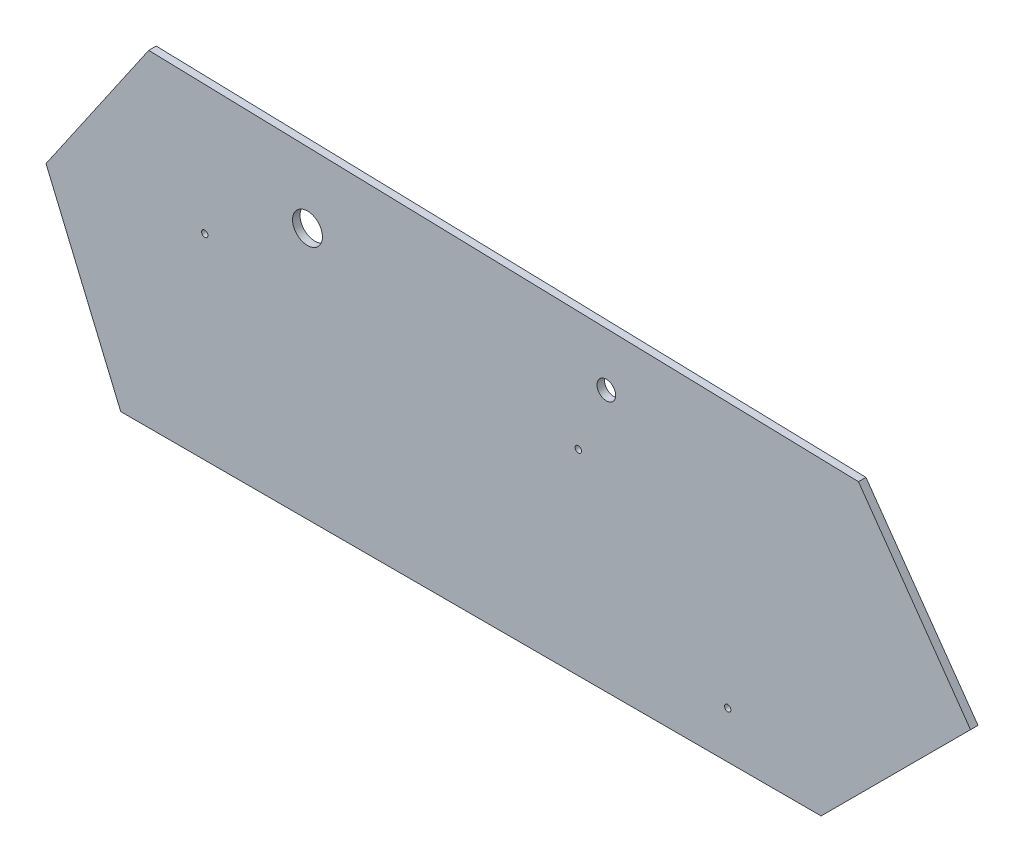
ISO-10303-21;
HEADER;
FILE_DESCRIPTION(('STEP AP214'),'2;1');
FILE_NAME('part.step','',(''),(''),'','','');
FILE_SCHEMA(('AUTOMOTIVE_DESIGN { 1 0 10303 214 1 1 1 1 }'));
ENDSEC;
DATA;
#1=APPLICATION_CONTEXT('core data for automotive mechanical design processes');
#2=APPLICATION_PROTOCOL_DEFINITION('international standard','automotive_design',2000,#1);
#3=PRODUCT_CONTEXT('',#1,'mechanical');
#4=PRODUCT('Part','Part','',(#3));
#5=PRODUCT_RELATED_PRODUCT_CATEGORY('part','',(#4));
#6=PRODUCT_DEFINITION_FORMATION('','',#4);
#7=PRODUCT_DEFINITION_CONTEXT('part definition',#1,'design');
#8=PRODUCT_DEFINITION('design','',#6,#7);
#9=PRODUCT_DEFINITION_SHAPE('','',#8);
#10=(LENGTH_UNIT() NAMED_UNIT(*) SI_UNIT(.MILLI.,.METRE.));
#11=(NAMED_UNIT(*) PLANE_ANGLE_UNIT() SI_UNIT($,.RADIAN.));
#12=(NAMED_UNIT(*) SI_UNIT($,.STERADIAN.) SOLID_ANGLE_UNIT());
#13=UNCERTAINTY_MEASURE_WITH_UNIT(LENGTH_MEASURE(1.E-05),#10,'distance_accuracy_value','');
#14=(GEOMETRIC_REPRESENTATION_CONTEXT(3) GLOBAL_UNCERTAINTY_ASSIGNED_CONTEXT((#13)) GLOBAL_UNIT_ASSIGNED_CONTEXT((#10,
#11,#12)) REPRESENTATION_CONTEXT('',''));
#15=CARTESIAN_POINT('',(0.,0.,0.));
#16=DIRECTION('',(0.,0.,1.));
#17=DIRECTION('',(1.,0.,0.));
#18=AXIS2_PLACEMENT_3D('',#15,#16,#17);
#19=CARTESIAN_POINT('',(0.,0.,4.));
#20=DIRECTION('',(0.,0.,1.));
#21=DIRECTION('',(1.,0.,0.));
#22=AXIS2_PLACEMENT_3D('',#19,#20,#21);
#23=PLANE('',#22);
#24=CARTESIAN_POINT('',(-25.,90.,4.));
#25=DIRECTION('',(0.,0.,1.));
#26=DIRECTION('',(1.,0.,0.));
#27=AXIS2_PLACEMENT_3D('',#24,#25,#26);
#28=CIRCLE('',#27,8.);
#29=CARTESIAN_POINT('',(-17.,90.,4.));
#30=VERTEX_POINT('',#29);
#31=EDGE_CURVE('E203',#30,#30,#28,.T.);
#32=ORIENTED_EDGE('',*,*,#31,.F.);
#33=EDGE_LOOP('',(#32));
#34=FACE_BOUND('',#33,.T.);
#35=CARTESIAN_POINT('',(120.,60.,4.));
#36=DIRECTION('',(0.,0.,1.));
#37=DIRECTION('',(1.,0.,0.));
#38=AXIS2_PLACEMENT_3D('',#35,#36,#37);
#39=CIRCLE('',#38,1.7);
#40=CARTESIAN_POINT('',(121.7,60.,4.));
#41=VERTEX_POINT('',#40);
#42=EDGE_CURVE('E213',#41,#41,#39,.T.);
#43=ORIENTED_EDGE('',*,*,#42,.F.);
#44=EDGE_LOOP('',(#43));
#45=FACE_BOUND('',#44,.T.);
#46=DIRECTION('',(0.388057000058133,-0.921635375138065,0.));
#47=VECTOR('',#46,1.);
#48=CARTESIAN_POINT('',(-165.,50.,4.));
#49=LINE('',#48,#47);
#50=CARTESIAN_POINT('',(-165.,50.,4.));
#51=VERTEX_POINT('',#50);
#52=CARTESIAN_POINT('',(-125.,-45.,4.));
#53=VERTEX_POINT('',#52);
#54=EDGE_CURVE('E140',#51,#53,#49,.T.);
#55=ORIENTED_EDGE('',*,*,#54,.T.);
#56=DIRECTION('',(1.,0.,0.));
#57=VECTOR('',#56,1.);
#58=CARTESIAN_POINT('',(-125.,-45.,4.));
#59=LINE('',#58,#57);
#60=CARTESIAN_POINT('',(250.,-45.,4.));
#61=VERTEX_POINT('',#60);
#62=EDGE_CURVE('E92',#53,#61,#59,.T.);
#63=ORIENTED_EDGE('',*,*,#62,.T.);
#64=DIRECTION('',(0.707106781186546,0.707106781186549,0.));
#65=VECTOR('',#64,1.);
#66=CARTESIAN_POINT('',(250.,-45.,4.));
#67=LINE('',#66,#65);
#68=CARTESIAN_POINT('',(330.,35.0000000000002,4.));
#69=VERTEX_POINT('',#68);
#70=EDGE_CURVE('E107',#61,#69,#67,.T.);
#71=ORIENTED_EDGE('',*,*,#70,.T.);
#72=DIRECTION('',(-0.576683197598655,0.816967863264762,0.));
#73=VECTOR('',#72,1.);
#74=CARTESIAN_POINT('',(330.,35.0000000000002,4.));
#75=LINE('',#74,#73);
#76=CARTESIAN_POINT('',(270.,120.,4.));
#77=VERTEX_POINT('',#76);
#78=EDGE_CURVE('E105',#69,#77,#75,.T.);
#79=ORIENTED_EDGE('',*,*,#78,.T.);
#80=DIRECTION('',(-0.999653919352847,0.0263066820882328,0.));
#81=VECTOR('',#80,1.);
#82=CARTESIAN_POINT('',(270.,120.,4.));
#83=LINE('',#82,#81);
#84=CARTESIAN_POINT('',(-110.,130.,4.));
#85=VERTEX_POINT('',#84);
#86=EDGE_CURVE('E106',#77,#85,#83,.T.);
#87=ORIENTED_EDGE('',*,*,#86,.T.);
#88=DIRECTION('',(-0.566528822887065,-0.824041924199368,0.));
#89=VECTOR('',#88,1.);
#90=CARTESIAN_POINT('',(-110.,130.,4.));
#91=LINE('',#90,#89);
#92=EDGE_CURVE('E59',#85,#51,#91,.T.);
#93=ORIENTED_EDGE('',*,*,#92,.T.);
#94=EDGE_LOOP('',(#55,#63,#71,#79,#87,#93));
#95=FACE_BOUND('',#94,.T.);
#96=CARTESIAN_POINT('',(-80.,60.,4.));
#97=DIRECTION('',(0.,0.,1.));
#98=DIRECTION('',(1.,0.,0.));
#99=AXIS2_PLACEMENT_3D('',#96,#97,#98);
#100=CIRCLE('',#99,1.7);
#101=CARTESIAN_POINT('',(-78.3,60.,4.));
#102=VERTEX_POINT('',#101);
#103=EDGE_CURVE('E128',#102,#102,#100,.T.);
#104=ORIENTED_EDGE('',*,*,#103,.F.);
#105=EDGE_LOOP('',(#104));
#106=FACE_BOUND('',#105,.T.);
#107=CARTESIAN_POINT('',(200.,-20.,4.));
#108=DIRECTION('',(0.,0.,1.));
#109=DIRECTION('',(1.,0.,0.));
#110=AXIS2_PLACEMENT_3D('',#107,#108,#109);
#111=CIRCLE('',#110,1.70000000000001);
#112=CARTESIAN_POINT('',(201.7,-20.,4.));
#113=VERTEX_POINT('',#112);
#114=EDGE_CURVE('E210',#113,#113,#111,.T.);
#115=ORIENTED_EDGE('',*,*,#114,.F.);
#116=EDGE_LOOP('',(#115));
#117=FACE_BOUND('',#116,.T.);
#118=CARTESIAN_POINT('',(135.,95.,4.));
#119=DIRECTION('',(0.,0.,1.));
#120=DIRECTION('',(1.,0.,0.));
#121=AXIS2_PLACEMENT_3D('',#118,#119,#120);
#122=CIRCLE('',#121,4.99999999999999);
#123=CARTESIAN_POINT('',(140.,95.,4.));
#124=VERTEX_POINT('',#123);
#125=EDGE_CURVE('E195',#124,#124,#122,.T.);
#126=ORIENTED_EDGE('',*,*,#125,.F.);
#127=EDGE_LOOP('',(#126));
#128=FACE_BOUND('',#127,.T.);
#129=ADVANCED_FACE('F41',(#34,#45,#95,#106,#117,#128),#23,.T.);
#130=CARTESIAN_POINT('',(0.,0.,0.));
#131=DIRECTION('',(0.,0.,1.));
#132=DIRECTION('',(1.,0.,0.));
#133=AXIS2_PLACEMENT_3D('',#130,#131,#132);
#134=PLANE('',#133);
#135=DIRECTION('',(0.388057000058133,-0.921635375138065,0.));
#136=VECTOR('',#135,1.);
#137=CARTESIAN_POINT('',(-165.,50.,0.));
#138=LINE('',#137,#136);
#139=CARTESIAN_POINT('',(-165.,50.,0.));
#140=VERTEX_POINT('',#139);
#141=CARTESIAN_POINT('',(-125.,-45.,0.));
#142=VERTEX_POINT('',#141);
#143=EDGE_CURVE('E127',#140,#142,#138,.T.);
#144=ORIENTED_EDGE('',*,*,#143,.F.);
#145=DIRECTION('',(-0.566528822887065,-0.824041924199368,0.));
#146=VECTOR('',#145,1.);
#147=CARTESIAN_POINT('',(-110.,130.,0.));
#148=LINE('',#147,#146);
#149=CARTESIAN_POINT('',(-110.,130.,0.));
#150=VERTEX_POINT('',#149);
#151=EDGE_CURVE('E87',#150,#140,#148,.T.);
#152=ORIENTED_EDGE('',*,*,#151,.F.);
#153=DIRECTION('',(-0.999653919352847,0.0263066820882328,0.));
#154=VECTOR('',#153,1.);
#155=CARTESIAN_POINT('',(270.,120.,0.));
#156=LINE('',#155,#154);
#157=CARTESIAN_POINT('',(270.,120.,0.));
#158=VERTEX_POINT('',#157);
#159=EDGE_CURVE('E82',#158,#150,#156,.T.);
#160=ORIENTED_EDGE('',*,*,#159,.F.);
#161=DIRECTION('',(-0.576683197598655,0.816967863264762,0.));
#162=VECTOR('',#161,1.);
#163=CARTESIAN_POINT('',(330.,35.0000000000002,0.));
#164=LINE('',#163,#162);
#165=CARTESIAN_POINT('',(330.,35.0000000000002,0.));
#166=VERTEX_POINT('',#165);
#167=EDGE_CURVE('E116',#166,#158,#164,.T.);
#168=ORIENTED_EDGE('',*,*,#167,.F.);
#169=DIRECTION('',(0.707106781186546,0.707106781186549,0.));
#170=VECTOR('',#169,1.);
#171=CARTESIAN_POINT('',(250.,-45.,0.));
#172=LINE('',#171,#170);
#173=CARTESIAN_POINT('',(250.,-45.,0.));
#174=VERTEX_POINT('',#173);
#175=EDGE_CURVE('E135',#174,#166,#172,.T.);
#176=ORIENTED_EDGE('',*,*,#175,.F.);
#177=DIRECTION('',(1.,0.,0.));
#178=VECTOR('',#177,1.);
#179=CARTESIAN_POINT('',(-125.,-45.,0.));
#180=LINE('',#179,#178);
#181=EDGE_CURVE('E129',#142,#174,#180,.T.);
#182=ORIENTED_EDGE('',*,*,#181,.F.);
#183=EDGE_LOOP('',(#144,#152,#160,#168,#176,#182));
#184=FACE_BOUND('',#183,.T.);
#185=CARTESIAN_POINT('',(-80.,60.,0.));
#186=DIRECTION('',(0.,0.,1.));
#187=DIRECTION('',(1.,0.,0.));
#188=AXIS2_PLACEMENT_3D('',#185,#186,#187);
#189=CIRCLE('',#188,1.7);
#190=CARTESIAN_POINT('',(-78.3,60.,0.));
#191=VERTEX_POINT('',#190);
#192=EDGE_CURVE('E216',#191,#191,#189,.T.);
#193=ORIENTED_EDGE('',*,*,#192,.T.);
#194=EDGE_LOOP('',(#193));
#195=FACE_BOUND('',#194,.T.);
#196=CARTESIAN_POINT('',(120.,60.,0.));
#197=DIRECTION('',(0.,0.,1.));
#198=DIRECTION('',(1.,0.,0.));
#199=AXIS2_PLACEMENT_3D('',#196,#197,#198);
#200=CIRCLE('',#199,1.7);
#201=CARTESIAN_POINT('',(121.7,60.,0.));
#202=VERTEX_POINT('',#201);
#203=EDGE_CURVE('E209',#202,#202,#200,.T.);
#204=ORIENTED_EDGE('',*,*,#203,.T.);
#205=EDGE_LOOP('',(#204));
#206=FACE_BOUND('',#205,.T.);
#207=CARTESIAN_POINT('',(200.,-20.,0.));
#208=DIRECTION('',(0.,0.,1.));
#209=DIRECTION('',(1.,0.,0.));
#210=AXIS2_PLACEMENT_3D('',#207,#208,#209);
#211=CIRCLE('',#210,1.70000000000001);
#212=CARTESIAN_POINT('',(201.7,-20.,0.));
#213=VERTEX_POINT('',#212);
#214=EDGE_CURVE('E204',#213,#213,#211,.T.);
#215=ORIENTED_EDGE('',*,*,#214,.T.);
#216=EDGE_LOOP('',(#215));
#217=FACE_BOUND('',#216,.T.);
#218=CARTESIAN_POINT('',(-25.,90.,0.));
#219=DIRECTION('',(0.,0.,1.));
#220=DIRECTION('',(1.,0.,0.));
#221=AXIS2_PLACEMENT_3D('',#218,#219,#220);
#222=CIRCLE('',#221,8.);
#223=CARTESIAN_POINT('',(-17.,90.,0.));
#224=VERTEX_POINT('',#223);
#225=EDGE_CURVE('E196',#224,#224,#222,.T.);
#226=ORIENTED_EDGE('',*,*,#225,.T.);
#227=EDGE_LOOP('',(#226));
#228=FACE_BOUND('',#227,.T.);
#229=CARTESIAN_POINT('',(135.,95.,0.));
#230=DIRECTION('',(0.,0.,1.));
#231=DIRECTION('',(1.,0.,0.));
#232=AXIS2_PLACEMENT_3D('',#229,#230,#231);
#233=CIRCLE('',#232,4.99999999999999);
#234=CARTESIAN_POINT('',(140.,95.,0.));
#235=VERTEX_POINT('',#234);
#236=EDGE_CURVE('E191',#235,#235,#233,.T.);
#237=ORIENTED_EDGE('',*,*,#236,.T.);
#238=EDGE_LOOP('',(#237));
#239=FACE_BOUND('',#238,.T.);
#240=ADVANCED_FACE('F148',(#184,#195,#206,#217,#228,#239),#134,.F.);
#241=CARTESIAN_POINT('',(-165.,50.,4.));
#242=DIRECTION('',(0.921635375138065,0.388057000058133,0.));
#243=DIRECTION('',(-0.388057000058133,0.921635375138065,0.));
#244=AXIS2_PLACEMENT_3D('',#241,#242,#243);
#245=PLANE('',#244);
#246=ORIENTED_EDGE('',*,*,#143,.T.);
#247=DIRECTION('',(0.,0.,-1.));
#248=VECTOR('',#247,1.);
#249=CARTESIAN_POINT('',(-125.,-45.,4.));
#250=LINE('',#249,#248);
#251=EDGE_CURVE('E11',#53,#142,#250,.T.);
#252=ORIENTED_EDGE('',*,*,#251,.F.);
#253=ORIENTED_EDGE('',*,*,#54,.F.);
#254=DIRECTION('',(0.,0.,-1.));
#255=VECTOR('',#254,1.);
#256=CARTESIAN_POINT('',(-165.,50.,4.));
#257=LINE('',#256,#255);
#258=EDGE_CURVE('E125',#51,#140,#257,.T.);
#259=ORIENTED_EDGE('',*,*,#258,.T.);
#260=EDGE_LOOP('',(#246,#252,#253,#259));
#261=FACE_BOUND('',#260,.T.);
#262=ADVANCED_FACE('F43',(#261),#245,.F.);
#263=CARTESIAN_POINT('',(-125.,-45.,4.));
#264=DIRECTION('',(0.,1.,0.));
#265=DIRECTION('',(0.,0.,1.));
#266=AXIS2_PLACEMENT_3D('',#263,#264,#265);
#267=PLANE('',#266);
#268=ORIENTED_EDGE('',*,*,#181,.T.);
#269=DIRECTION('',(0.,0.,-1.));
#270=VECTOR('',#269,1.);
#271=CARTESIAN_POINT('',(250.,-45.,4.));
#272=LINE('',#271,#270);
#273=EDGE_CURVE('E49',#61,#174,#272,.T.);
#274=ORIENTED_EDGE('',*,*,#273,.F.);
#275=ORIENTED_EDGE('',*,*,#62,.F.);
#276=ORIENTED_EDGE('',*,*,#251,.T.);
#277=EDGE_LOOP('',(#268,#274,#275,#276));
#278=FACE_BOUND('',#277,.T.);
#279=ADVANCED_FACE('F288',(#278),#267,.F.);
#280=CARTESIAN_POINT('',(250.,-45.,4.));
#281=DIRECTION('',(-0.707106781186549,0.707106781186546,0.));
#282=DIRECTION('',(-0.707106781186546,-0.707106781186549,0.));
#283=AXIS2_PLACEMENT_3D('',#280,#281,#282);
#284=PLANE('',#283);
#285=ORIENTED_EDGE('',*,*,#175,.T.);
#286=DIRECTION('',(0.,0.,-1.));
#287=VECTOR('',#286,1.);
#288=CARTESIAN_POINT('',(330.,35.0000000000002,4.));
#289=LINE('',#288,#287);
#290=EDGE_CURVE('E120',#69,#166,#289,.T.);
#291=ORIENTED_EDGE('',*,*,#290,.F.);
#292=ORIENTED_EDGE('',*,*,#70,.F.);
#293=ORIENTED_EDGE('',*,*,#273,.T.);
#294=EDGE_LOOP('',(#285,#291,#292,#293));
#295=FACE_BOUND('',#294,.T.);
#296=ADVANCED_FACE('F141',(#295),#284,.F.);
#297=CARTESIAN_POINT('',(330.,35.0000000000002,4.));
#298=DIRECTION('',(-0.816967863264762,-0.576683197598655,0.));
#299=DIRECTION('',(0.576683197598655,-0.816967863264762,0.));
#300=AXIS2_PLACEMENT_3D('',#297,#298,#299);
#301=PLANE('',#300);
#302=ORIENTED_EDGE('',*,*,#167,.T.);
#303=DIRECTION('',(0.,0.,-1.));
#304=VECTOR('',#303,1.);
#305=CARTESIAN_POINT('',(270.,120.,4.));
#306=LINE('',#305,#304);
#307=EDGE_CURVE('E114',#77,#158,#306,.T.);
#308=ORIENTED_EDGE('',*,*,#307,.F.);
#309=ORIENTED_EDGE('',*,*,#78,.F.);
#310=ORIENTED_EDGE('',*,*,#290,.T.);
#311=EDGE_LOOP('',(#302,#308,#309,#310));
#312=FACE_BOUND('',#311,.T.);
#313=ADVANCED_FACE('F111',(#312),#301,.F.);
#314=CARTESIAN_POINT('',(270.,120.,4.));
#315=DIRECTION('',(-0.0263066820882328,-0.999653919352847,0.));
#316=DIRECTION('',(0.999653919352847,-0.0263066820882328,0.));
#317=AXIS2_PLACEMENT_3D('',#314,#315,#316);
#318=PLANE('',#317);
#319=ORIENTED_EDGE('',*,*,#159,.T.);
#320=DIRECTION('',(0.,0.,-1.));
#321=VECTOR('',#320,1.);
#322=CARTESIAN_POINT('',(-110.,130.,4.));
#323=LINE('',#322,#321);
#324=EDGE_CURVE('E117',#85,#150,#323,.T.);
#325=ORIENTED_EDGE('',*,*,#324,.F.);
#326=ORIENTED_EDGE('',*,*,#86,.F.);
#327=ORIENTED_EDGE('',*,*,#307,.T.);
#328=EDGE_LOOP('',(#319,#325,#326,#327));
#329=FACE_BOUND('',#328,.T.);
#330=ADVANCED_FACE('F119',(#329),#318,.F.);
#331=CARTESIAN_POINT('',(-110.,130.,4.));
#332=DIRECTION('',(0.824041924199368,-0.566528822887065,0.));
#333=DIRECTION('',(0.566528822887065,0.824041924199368,0.));
#334=AXIS2_PLACEMENT_3D('',#331,#332,#333);
#335=PLANE('',#334);
#336=ORIENTED_EDGE('',*,*,#151,.T.);
#337=ORIENTED_EDGE('',*,*,#258,.F.);
#338=ORIENTED_EDGE('',*,*,#92,.F.);
#339=ORIENTED_EDGE('',*,*,#324,.T.);
#340=EDGE_LOOP('',(#336,#337,#338,#339));
#341=FACE_BOUND('',#340,.T.);
#342=ADVANCED_FACE('F151',(#341),#335,.F.);
#343=CARTESIAN_POINT('',(-80.,60.,4.));
#344=DIRECTION('',(0.,0.,-1.));
#345=DIRECTION('',(-1.,0.,0.));
#346=AXIS2_PLACEMENT_3D('',#343,#344,#345);
#347=CYLINDRICAL_SURFACE('',#346,1.7);
#348=ORIENTED_EDGE('',*,*,#103,.T.);
#349=EDGE_LOOP('',(#348));
#350=FACE_BOUND('',#349,.T.);
#351=ORIENTED_EDGE('',*,*,#192,.F.);
#352=EDGE_LOOP('',(#351));
#353=FACE_BOUND('',#352,.T.);
#354=ADVANCED_FACE('F153',(#350,#353),#347,.F.);
#355=CARTESIAN_POINT('',(120.,60.,4.));
#356=DIRECTION('',(0.,0.,-1.));
#357=DIRECTION('',(-1.,0.,0.));
#358=AXIS2_PLACEMENT_3D('',#355,#356,#357);
#359=CYLINDRICAL_SURFACE('',#358,1.7);
#360=ORIENTED_EDGE('',*,*,#42,.T.);
#361=EDGE_LOOP('',(#360));
#362=FACE_BOUND('',#361,.T.);
#363=ORIENTED_EDGE('',*,*,#203,.F.);
#364=EDGE_LOOP('',(#363));
#365=FACE_BOUND('',#364,.T.);
#366=ADVANCED_FACE('F157',(#362,#365),#359,.F.);
#367=CARTESIAN_POINT('',(200.,-20.,4.));
#368=DIRECTION('',(0.,0.,-1.));
#369=DIRECTION('',(-1.,0.,0.));
#370=AXIS2_PLACEMENT_3D('',#367,#368,#369);
#371=CYLINDRICAL_SURFACE('',#370,1.70000000000001);
#372=ORIENTED_EDGE('',*,*,#114,.T.);
#373=EDGE_LOOP('',(#372));
#374=FACE_BOUND('',#373,.T.);
#375=ORIENTED_EDGE('',*,*,#214,.F.);
#376=EDGE_LOOP('',(#375));
#377=FACE_BOUND('',#376,.T.);
#378=ADVANCED_FACE('F174',(#374,#377),#371,.F.);
#379=CARTESIAN_POINT('',(-25.,90.,4.));
#380=DIRECTION('',(0.,0.,-1.));
#381=DIRECTION('',(-1.,0.,0.));
#382=AXIS2_PLACEMENT_3D('',#379,#380,#381);
#383=CYLINDRICAL_SURFACE('',#382,8.);
#384=ORIENTED_EDGE('',*,*,#31,.T.);
#385=EDGE_LOOP('',(#384));
#386=FACE_BOUND('',#385,.T.);
#387=ORIENTED_EDGE('',*,*,#225,.F.);
#388=EDGE_LOOP('',(#387));
#389=FACE_BOUND('',#388,.T.);
#390=ADVANCED_FACE('F179',(#386,#389),#383,.F.);
#391=CARTESIAN_POINT('',(135.,95.,4.));
#392=DIRECTION('',(0.,0.,-1.));
#393=DIRECTION('',(-1.,0.,0.));
#394=AXIS2_PLACEMENT_3D('',#391,#392,#393);
#395=CYLINDRICAL_SURFACE('',#394,4.99999999999999);
#396=ORIENTED_EDGE('',*,*,#125,.T.);
#397=EDGE_LOOP('',(#396));
#398=FACE_BOUND('',#397,.T.);
#399=ORIENTED_EDGE('',*,*,#236,.F.);
#400=EDGE_LOOP('',(#399));
#401=FACE_BOUND('',#400,.T.);
#402=ADVANCED_FACE('F181',(#398,#401),#395,.F.);
#403=CLOSED_SHELL('',(#129,#240,#262,#279,#296,#313,#330,#342,#354,#366,#378,#390,#402));
#404=MANIFOLD_SOLID_BREP('B2',#403);
#405=ADVANCED_BREP_SHAPE_REPRESENTATION('',(#18,#404),#14);
#406=SHAPE_DEFINITION_REPRESENTATION(#9,#405);
ENDSEC;
END-ISO-10303-21;
